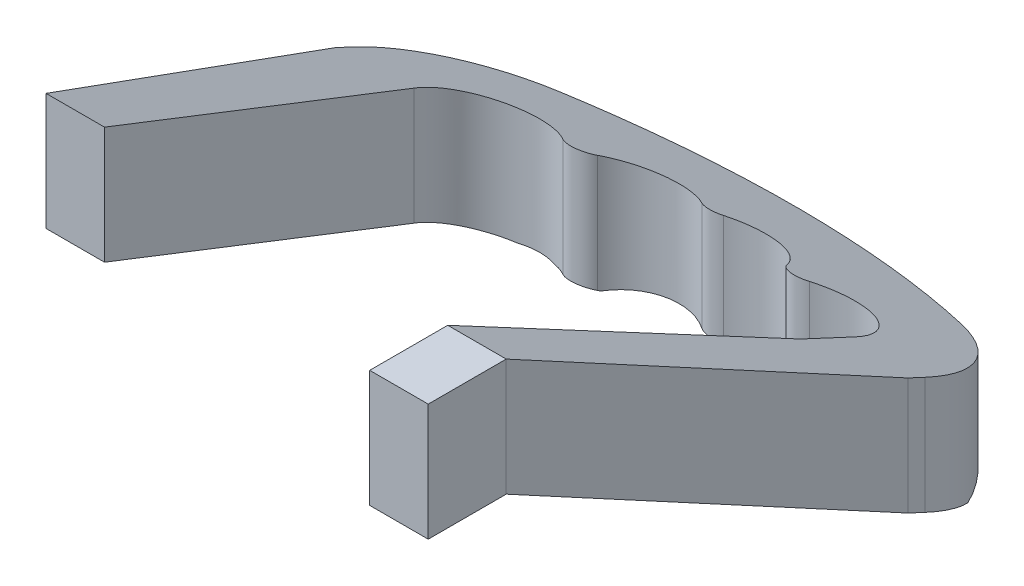
ISO-10303-21;
HEADER;
FILE_DESCRIPTION(('STEP AP214'),'2;1');
FILE_NAME('part.step','',(''),(''),'','','');
FILE_SCHEMA(('AUTOMOTIVE_DESIGN { 1 0 10303 214 1 1 1 1 }'));
ENDSEC;
DATA;
#1=APPLICATION_CONTEXT('core data for automotive mechanical design processes');
#2=APPLICATION_PROTOCOL_DEFINITION('international standard','automotive_design',2000,#1);
#3=PRODUCT_CONTEXT('',#1,'mechanical');
#4=PRODUCT('Part','Part','',(#3));
#5=PRODUCT_RELATED_PRODUCT_CATEGORY('part','',(#4));
#6=PRODUCT_DEFINITION_FORMATION('','',#4);
#7=PRODUCT_DEFINITION_CONTEXT('part definition',#1,'design');
#8=PRODUCT_DEFINITION('design','',#6,#7);
#9=PRODUCT_DEFINITION_SHAPE('','',#8);
#10=(LENGTH_UNIT() NAMED_UNIT(*) SI_UNIT(.MILLI.,.METRE.));
#11=(NAMED_UNIT(*) PLANE_ANGLE_UNIT() SI_UNIT($,.RADIAN.));
#12=(NAMED_UNIT(*) SI_UNIT($,.STERADIAN.) SOLID_ANGLE_UNIT());
#13=UNCERTAINTY_MEASURE_WITH_UNIT(LENGTH_MEASURE(1.E-05),#10,'distance_accuracy_value','');
#14=(GEOMETRIC_REPRESENTATION_CONTEXT(3) GLOBAL_UNCERTAINTY_ASSIGNED_CONTEXT((#13)) GLOBAL_UNIT_ASSIGNED_CONTEXT((#10,
#11,#12)) REPRESENTATION_CONTEXT('',''));
#15=CARTESIAN_POINT('',(0.,0.,0.));
#16=DIRECTION('',(0.,0.,1.));
#17=DIRECTION('',(1.,0.,0.));
#18=AXIS2_PLACEMENT_3D('',#15,#16,#17);
#19=CARTESIAN_POINT('',(37.465,14.4738745452836,-12.7));
#20=DIRECTION('',(0.,1.,0.));
#21=DIRECTION('',(0.,0.,1.));
#22=AXIS2_PLACEMENT_3D('',#19,#20,#21);
#23=PLANE('',#22);
#24=DIRECTION('',(0.,0.,1.));
#25=VECTOR('',#24,1.);
#26=CARTESIAN_POINT('',(37.465,14.4738745452836,-12.7));
#27=LINE('',#26,#25);
#28=CARTESIAN_POINT('',(37.465,14.4738745452836,-12.7));
#29=VERTEX_POINT('',#28);
#30=CARTESIAN_POINT('',(37.465,14.4738745452836,0.));
#31=VERTEX_POINT('',#30);
#32=EDGE_CURVE('E325',#29,#31,#27,.T.);
#33=ORIENTED_EDGE('',*,*,#32,.F.);
#34=DIRECTION('',(1.,0.,0.));
#35=VECTOR('',#34,1.);
#36=CARTESIAN_POINT('',(-46.5828276625066,14.4738745452836,-12.7));
#37=LINE('',#36,#35);
#38=CARTESIAN_POINT('',(27.94,14.4738745452836,-12.7));
#39=VERTEX_POINT('',#38);
#40=EDGE_CURVE('E449',#39,#29,#37,.T.);
#41=ORIENTED_EDGE('',*,*,#40,.F.);
#42=DIRECTION('',(0.,0.,1.));
#43=VECTOR('',#42,1.);
#44=CARTESIAN_POINT('',(27.94,14.4738745452836,-12.7));
#45=LINE('',#44,#43);
#46=CARTESIAN_POINT('',(27.94,14.4738745452836,0.));
#47=VERTEX_POINT('',#46);
#48=EDGE_CURVE('E339',#39,#47,#45,.T.);
#49=ORIENTED_EDGE('',*,*,#48,.T.);
#50=DIRECTION('',(-1.,0.,0.));
#51=VECTOR('',#50,1.);
#52=CARTESIAN_POINT('',(37.465,14.4738745452836,0.));
#53=LINE('',#52,#51);
#54=EDGE_CURVE('E264',#31,#47,#53,.T.);
#55=ORIENTED_EDGE('',*,*,#54,.F.);
#56=EDGE_LOOP('',(#33,#41,#49,#55));
#57=FACE_BOUND('',#56,.T.);
#58=ADVANCED_FACE('F71',(#57),#23,.T.);
#59=CARTESIAN_POINT('',(25.6698397491977,-36.3261254547164,-71.7460753438856));
#60=DIRECTION('',(0.,1.,0.));
#61=DIRECTION('',(0.,0.,1.));
#62=AXIS2_PLACEMENT_3D('',#59,#60,#61);
#63=CYLINDRICAL_SURFACE('',#62,20.9129879133088);
#64=DIRECTION('',(0.,1.,0.));
#65=VECTOR('',#64,1.);
#66=CARTESIAN_POINT('',(32.7148928779582,-36.3261254547164,-91.4366896023373));
#67=LINE('',#66,#65);
#68=CARTESIAN_POINT('',(32.7148928779582,-36.3261254547164,-91.4366896023373));
#69=VERTEX_POINT('',#68);
#70=CARTESIAN_POINT('',(32.7148928779582,-22.2416467940594,-91.4366896023373));
#71=VERTEX_POINT('',#70);
#72=EDGE_CURVE('E313',#69,#71,#67,.T.);
#73=ORIENTED_EDGE('',*,*,#72,.T.);
#74=CARTESIAN_POINT('',(25.6698397491977,-13.0597625715673,-71.7460753438856));
#75=DIRECTION('',(0.,0.90630778703665,-0.4226182617407));
#76=DIRECTION('',(0.,0.4226182617407,0.90630778703665));
#77=AXIS2_PLACEMENT_3D('',#74,#75,#76);
#78=ELLIPSE('',#77,23.0749290830744,20.9129879133088);
#79=CARTESIAN_POINT('',(46.5828276625066,-13.0597625715673,-71.7460753438856));
#80=VERTEX_POINT('',#79);
#81=EDGE_CURVE('E86',#71,#80,#78,.F.);
#82=ORIENTED_EDGE('',*,*,#81,.T.);
#83=DIRECTION('',(0.,1.,0.));
#84=VECTOR('',#83,1.);
#85=CARTESIAN_POINT('',(46.5828276625066,-36.3261254547164,-71.7460753438856));
#86=LINE('',#85,#84);
#87=CARTESIAN_POINT('',(46.5828276625066,-32.1097625715673,-71.7460753438856));
#88=VERTEX_POINT('',#87);
#89=EDGE_CURVE('E253',#88,#80,#86,.T.);
#90=ORIENTED_EDGE('',*,*,#89,.F.);
#91=CARTESIAN_POINT('',(25.6698397491977,-32.1097625715673,-71.7460753438856));
#92=DIRECTION('',(0.,0.90630778703665,-0.4226182617407));
#93=DIRECTION('',(0.,0.4226182617407,0.90630778703665));
#94=AXIS2_PLACEMENT_3D('',#91,#92,#93);
#95=ELLIPSE('',#94,23.0749290830744,20.9129879133088);
#96=CARTESIAN_POINT('',(44.5270651270852,-36.3261254547164,-80.7880947261784));
#97=VERTEX_POINT('',#96);
#98=EDGE_CURVE('E236',#97,#88,#95,.F.);
#99=ORIENTED_EDGE('',*,*,#98,.F.);
#100=CARTESIAN_POINT('',(25.6698397491977,-36.3261254547164,-71.7460753438856));
#101=DIRECTION('',(0.,1.,0.));
#102=DIRECTION('',(0.,0.,1.));
#103=AXIS2_PLACEMENT_3D('',#100,#101,#102);
#104=CIRCLE('',#103,20.9129879133088);
#105=EDGE_CURVE('E379',#97,#69,#104,.T.);
#106=ORIENTED_EDGE('',*,*,#105,.T.);
#107=EDGE_LOOP('',(#73,#82,#90,#99,#106));
#108=FACE_BOUND('',#107,.T.);
#109=ADVANCED_FACE('F260',(#108),#63,.T.);
#110=CARTESIAN_POINT('',(46.5828276625068,-36.3261254547164,-1.16760736321943E-13));
#111=DIRECTION('',(1.,0.,0.));
#112=DIRECTION('',(0.,0.,-1.));
#113=AXIS2_PLACEMENT_3D('',#110,#111,#112);
#114=PLANE('',#113);
#115=ORIENTED_EDGE('',*,*,#89,.T.);
#116=DIRECTION('',(0.,0.4226182617407,0.90630778703665));
#117=VECTOR('',#116,1.);
#118=CARTESIAN_POINT('',(46.5828276625066,-24.8885481664377,-97.1129879133088));
#119=LINE('',#118,#117);
#120=CARTESIAN_POINT('',(46.5828276625066,-11.7688649000295,-68.9777363536031));
#121=VERTEX_POINT('',#120);
#122=EDGE_CURVE('E257',#80,#121,#119,.T.);
#123=ORIENTED_EDGE('',*,*,#122,.T.);
#124=DIRECTION('',(0.,1.,0.));
#125=VECTOR('',#124,1.);
#126=CARTESIAN_POINT('',(46.5828276625066,-36.3261254547164,-68.9777363536031));
#127=LINE('',#126,#125);
#128=CARTESIAN_POINT('',(46.5828276625066,-30.8188649000295,-68.9777363536031));
#129=VERTEX_POINT('',#128);
#130=EDGE_CURVE('E255',#129,#121,#127,.T.);
#131=ORIENTED_EDGE('',*,*,#130,.F.);
#132=DIRECTION('',(0.,0.4226182617407,0.90630778703665));
#133=VECTOR('',#132,1.);
#134=CARTESIAN_POINT('',(46.5828276625066,-36.3261254547164,-80.7880947261784));
#135=LINE('',#134,#133);
#136=EDGE_CURVE('E239',#88,#129,#135,.T.);
#137=ORIENTED_EDGE('',*,*,#136,.F.);
#138=EDGE_LOOP('',(#115,#123,#131,#137));
#139=FACE_BOUND('',#138,.T.);
#140=ADVANCED_FACE('F251',(#139),#114,.T.);
#141=CARTESIAN_POINT('',(34.5017812224407,-36.3261254547164,5.58980008113953));
#142=DIRECTION('',(0.987128448086942,0.,0.159929443747751));
#143=DIRECTION('',(0.159929443747751,0.,-0.987128448086942));
#144=AXIS2_PLACEMENT_3D('',#141,#142,#143);
#145=PLANE('',#144);
#146=ORIENTED_EDGE('',*,*,#130,.T.);
#147=DIRECTION('',(-0.145277514777013,0.418134681710762,0.896692718633789));
#148=VECTOR('',#147,1.);
#149=CARTESIAN_POINT('',(38.1057351782418,12.6297240569836,-16.6547934846205));
#150=LINE('',#149,#148);
#151=EDGE_CURVE('E381',#121,#29,#150,.T.);
#152=ORIENTED_EDGE('',*,*,#151,.T.);
#153=DIRECTION('',(0.,1.,0.));
#154=VECTOR('',#153,1.);
#155=CARTESIAN_POINT('',(37.465,-4.57612545471637,-12.7));
#156=LINE('',#155,#154);
#157=CARTESIAN_POINT('',(37.465,-4.57612545471637,-12.7));
#158=VERTEX_POINT('',#157);
#159=EDGE_CURVE('E316',#158,#29,#156,.T.);
#160=ORIENTED_EDGE('',*,*,#159,.F.);
#161=DIRECTION('',(-0.145277514777013,0.418134681710762,0.896692718633789));
#162=VECTOR('',#161,1.);
#163=CARTESIAN_POINT('',(36.9485321192525,-3.0896384834761,-9.51221840292794));
#164=LINE('',#163,#162);
#165=EDGE_CURVE('E246',#129,#158,#164,.T.);
#166=ORIENTED_EDGE('',*,*,#165,.F.);
#167=EDGE_LOOP('',(#146,#152,#160,#166));
#168=FACE_BOUND('',#167,.T.);
#169=ADVANCED_FACE('F457',(#168),#145,.T.);
#170=CARTESIAN_POINT('',(25.5708811904425,-36.3261254547164,3.69504632170689));
#171=DIRECTION('',(-0.989720279713876,0.,-0.143016670088098));
#172=DIRECTION('',(-0.143016670088098,0.,0.989720279713876));
#173=AXIS2_PLACEMENT_3D('',#170,#171,#172);
#174=PLANE('',#173);
#175=DIRECTION('',(0.,-1.,0.));
#176=VECTOR('',#175,1.);
#177=CARTESIAN_POINT('',(27.94,14.4738745452836,-12.7));
#178=LINE('',#177,#176);
#179=CARTESIAN_POINT('',(27.94,-4.57612545471637,-12.7));
#180=VERTEX_POINT('',#179);
#181=EDGE_CURVE('E319',#39,#180,#178,.T.);
#182=ORIENTED_EDGE('',*,*,#181,.F.);
#183=DIRECTION('',(0.129854529110926,-0.419039976612588,-0.898634129815856));
#184=VECTOR('',#183,1.);
#185=CARTESIAN_POINT('',(28.7511287611418,11.8563657111614,-18.3132658092701));
#186=LINE('',#185,#184);
#187=CARTESIAN_POINT('',(35.1948397491978,-8.93746042813854,-62.9057698688712));
#188=VERTEX_POINT('',#187);
#189=EDGE_CURVE('E384',#39,#188,#186,.T.);
#190=ORIENTED_EDGE('',*,*,#189,.T.);
#191=DIRECTION('',(0.,1.,0.));
#192=VECTOR('',#191,1.);
#193=CARTESIAN_POINT('',(35.1948397491978,-36.3261254547164,-62.9057698688712));
#194=LINE('',#193,#192);
#195=CARTESIAN_POINT('',(35.1948397491978,-27.9874604281385,-62.9057698688712));
#196=VERTEX_POINT('',#195);
#197=EDGE_CURVE('E266',#196,#188,#194,.T.);
#198=ORIENTED_EDGE('',*,*,#197,.F.);
#199=DIRECTION('',(0.129854529110926,-0.419039976612588,-0.898634129815856));
#200=VECTOR('',#199,1.);
#201=CARTESIAN_POINT('',(27.7145375112077,-3.8485590257486,-11.1397287579482));
#202=LINE('',#201,#200);
#203=EDGE_CURVE('E416',#180,#196,#202,.T.);
#204=ORIENTED_EDGE('',*,*,#203,.F.);
#205=EDGE_LOOP('',(#182,#190,#198,#204));
#206=FACE_BOUND('',#205,.T.);
#207=ADVANCED_FACE('F470',(#206),#174,.T.);
#208=CARTESIAN_POINT('',(35.1948397491978,-36.3261254547164,0.));
#209=DIRECTION('',(-1.,0.,0.));
#210=DIRECTION('',(0.,0.,1.));
#211=AXIS2_PLACEMENT_3D('',#208,#209,#210);
#212=PLANE('',#211);
#213=ORIENTED_EDGE('',*,*,#197,.T.);
#214=DIRECTION('',(0.,-0.4226182617407,-0.90630778703665));
#215=VECTOR('',#214,1.);
#216=CARTESIAN_POINT('',(35.1948397491978,10.2650620451272,-21.7258275337126));
#217=LINE('',#216,#215);
#218=CARTESIAN_POINT('',(35.1948397491977,-13.0597625715673,-71.7460753438856));
#219=VERTEX_POINT('',#218);
#220=EDGE_CURVE('E387',#188,#219,#217,.T.);
#221=ORIENTED_EDGE('',*,*,#220,.T.);
#222=DIRECTION('',(0.,1.,0.));
#223=VECTOR('',#222,1.);
#224=CARTESIAN_POINT('',(35.1948397491977,-36.3261254547164,-71.7460753438856));
#225=LINE('',#224,#223);
#226=CARTESIAN_POINT('',(35.1948397491977,-32.1097625715673,-71.7460753438856));
#227=VERTEX_POINT('',#226);
#228=EDGE_CURVE('E274',#227,#219,#225,.T.);
#229=ORIENTED_EDGE('',*,*,#228,.F.);
#230=DIRECTION('',(0.,-0.4226182617407,-0.90630778703665));
#231=VECTOR('',#230,1.);
#232=CARTESIAN_POINT('',(35.1948397491978,-5.38248993713707,-14.4292542130043));
#233=LINE('',#232,#231);
#234=EDGE_CURVE('E418',#196,#227,#233,.T.);
#235=ORIENTED_EDGE('',*,*,#234,.F.);
#236=EDGE_LOOP('',(#213,#221,#229,#235));
#237=FACE_BOUND('',#236,.T.);
#238=ADVANCED_FACE('F473',(#237),#212,.T.);
#239=CARTESIAN_POINT('',(25.6698397491977,-36.3261254547164,-71.7460753438856));
#240=DIRECTION('',(0.,1.,0.));
#241=DIRECTION('',(0.,0.,1.));
#242=AXIS2_PLACEMENT_3D('',#239,#240,#241);
#243=CYLINDRICAL_SURFACE('',#242,9.525);
#244=CARTESIAN_POINT('',(25.6698397491977,-13.0597625715673,-71.7460753438856));
#245=DIRECTION('',(0.,0.90630778703665,-0.4226182617407));
#246=DIRECTION('',(0.,0.4226182617407,0.90630778703665));
#247=AXIS2_PLACEMENT_3D('',#244,#245,#246);
#248=ELLIPSE('',#247,10.5096746781177,9.525);
#249=CARTESIAN_POINT('',(20.0598178212185,-16.6492194646361,-79.4436904919423));
#250=VERTEX_POINT('',#249);
#251=EDGE_CURVE('E390',#250,#219,#248,.F.);
#252=ORIENTED_EDGE('',*,*,#251,.F.);
#253=DIRECTION('',(0.,1.,0.));
#254=VECTOR('',#253,1.);
#255=CARTESIAN_POINT('',(20.0598178212185,-36.3261254547164,-79.4436904919423));
#256=LINE('',#255,#254);
#257=CARTESIAN_POINT('',(20.0598178212185,-35.6992194646361,-79.4436904919423));
#258=VERTEX_POINT('',#257);
#259=EDGE_CURVE('E277',#258,#250,#256,.T.);
#260=ORIENTED_EDGE('',*,*,#259,.F.);
#261=CARTESIAN_POINT('',(25.6698397491977,-32.1097625715673,-71.7460753438856));
#262=DIRECTION('',(0.,0.90630778703665,-0.4226182617407));
#263=DIRECTION('',(0.,0.4226182617407,0.90630778703665));
#264=AXIS2_PLACEMENT_3D('',#261,#262,#263);
#265=ELLIPSE('',#264,10.5096746781177,9.525);
#266=CARTESIAN_POINT('',(22.6752595632215,-36.3261254547164,-80.7880947261784));
#267=VERTEX_POINT('',#266);
#268=EDGE_CURVE('E421',#258,#267,#265,.F.);
#269=ORIENTED_EDGE('',*,*,#268,.T.);
#270=CARTESIAN_POINT('',(25.6698397491977,-36.3261254547164,-71.7460753438856));
#271=DIRECTION('',(0.,1.,0.));
#272=DIRECTION('',(0.,0.,1.));
#273=AXIS2_PLACEMENT_3D('',#270,#271,#272);
#274=CIRCLE('',#273,9.525);
#275=CARTESIAN_POINT('',(28.664419935174,-36.3261254547164,-80.7880947261784));
#276=VERTEX_POINT('',#275);
#277=EDGE_CURVE('E315',#276,#267,#274,.T.);
#278=ORIENTED_EDGE('',*,*,#277,.F.);
#279=EDGE_CURVE('E420',#276,#227,#265,.F.);
#280=ORIENTED_EDGE('',*,*,#279,.T.);
#281=ORIENTED_EDGE('',*,*,#228,.T.);
#282=EDGE_LOOP('',(#252,#260,#269,#278,#280,#281));
#283=FACE_BOUND('',#282,.T.);
#284=ADVANCED_FACE('F478',(#283),#243,.F.);
#285=CARTESIAN_POINT('',(18.1898105118921,-36.3261254547164,-82.0095622079612));
#286=DIRECTION('',(0.,1.,0.));
#287=DIRECTION('',(0.,0.,1.));
#288=AXIS2_PLACEMENT_3D('',#285,#286,#287);
#289=CYLINDRICAL_SURFACE('',#288,3.175);
#290=ORIENTED_EDGE('',*,*,#259,.T.);
#291=CARTESIAN_POINT('',(18.1898105118921,-17.845705095659,-82.0095622079612));
#292=DIRECTION('',(0.,0.90630778703665,-0.4226182617407));
#293=DIRECTION('',(0.,0.4226182617407,0.90630778703665));
#294=AXIS2_PLACEMENT_3D('',#291,#292,#293);
#295=ELLIPSE('',#294,3.50322489270592,3.175);
#296=CARTESIAN_POINT('',(15.4103126769711,-17.1301063817064,-80.4749558135821));
#297=VERTEX_POINT('',#296);
#298=EDGE_CURVE('E392',#250,#297,#295,.F.);
#299=ORIENTED_EDGE('',*,*,#298,.T.);
#300=DIRECTION('',(0.,1.,0.));
#301=VECTOR('',#300,1.);
#302=CARTESIAN_POINT('',(15.4103126769711,-36.3261254547164,-80.4749558135821));
#303=LINE('',#302,#301);
#304=CARTESIAN_POINT('',(15.4103126769711,-36.1801063817064,-80.4749558135821));
#305=VERTEX_POINT('',#304);
#306=EDGE_CURVE('E280',#305,#297,#303,.T.);
#307=ORIENTED_EDGE('',*,*,#306,.F.);
#308=CARTESIAN_POINT('',(18.1898105118921,-36.895705095659,-82.0095622079612));
#309=DIRECTION('',(0.,0.90630778703665,-0.4226182617407));
#310=DIRECTION('',(0.,0.4226182617407,0.90630778703665));
#311=AXIS2_PLACEMENT_3D('',#308,#309,#310);
#312=ELLIPSE('',#311,3.50322489270592,3.175);
#313=EDGE_CURVE('E423',#258,#305,#312,.F.);
#314=ORIENTED_EDGE('',*,*,#313,.F.);
#315=EDGE_LOOP('',(#290,#299,#307,#314));
#316=FACE_BOUND('',#315,.T.);
#317=ADVANCED_FACE('F483',(#316),#289,.T.);
#318=CARTESIAN_POINT('',(7.07181917220806,-36.3261254547164,-75.8711366304446));
#319=DIRECTION('',(0.,1.,0.));
#320=DIRECTION('',(0.,0.,1.));
#321=AXIS2_PLACEMENT_3D('',#318,#319,#320);
#322=CYLINDRICAL_SURFACE('',#321,9.52499999999999);
#323=CARTESIAN_POINT('',(7.07181917220806,-14.9833102398485,-75.8711366304446));
#324=DIRECTION('',(0.,0.90630778703665,-0.4226182617407));
#325=DIRECTION('',(0.,0.4226182617407,0.90630778703665));
#326=AXIS2_PLACEMENT_3D('',#323,#324,#325);
#327=ELLIPSE('',#326,10.5096746781177,9.52499999999999);
#328=CARTESIAN_POINT('',(1.76795479305202,-18.6725862468584,-83.7828145591472));
#329=VERTEX_POINT('',#328);
#330=EDGE_CURVE('E395',#329,#297,#327,.F.);
#331=ORIENTED_EDGE('',*,*,#330,.F.);
#332=DIRECTION('',(0.,1.,0.));
#333=VECTOR('',#332,1.);
#334=CARTESIAN_POINT('',(1.76795479305202,-36.3261254547164,-83.7828145591472));
#335=LINE('',#334,#333);
#336=CARTESIAN_POINT('',(1.76795479305202,-36.3261254547164,-83.7828145591472));
#337=VERTEX_POINT('',#336);
#338=EDGE_CURVE('E283',#337,#329,#335,.T.);
#339=ORIENTED_EDGE('',*,*,#338,.F.);
#340=CARTESIAN_POINT('',(7.07181917220806,-36.3261254547164,-75.8711366304446));
#341=DIRECTION('',(0.,1.,0.));
#342=DIRECTION('',(0.,0.,1.));
#343=AXIS2_PLACEMENT_3D('',#340,#341,#342);
#344=CIRCLE('',#343,9.52499999999999);
#345=CARTESIAN_POINT('',(15.2295852931996,-36.3261254547164,-80.7880947261784));
#346=VERTEX_POINT('',#345);
#347=EDGE_CURVE('E354',#346,#337,#344,.T.);
#348=ORIENTED_EDGE('',*,*,#347,.F.);
#349=CARTESIAN_POINT('',(7.07181917220806,-34.0333102398485,-75.8711366304446));
#350=DIRECTION('',(0.,0.90630778703665,-0.4226182617407));
#351=DIRECTION('',(0.,0.4226182617407,0.90630778703665));
#352=AXIS2_PLACEMENT_3D('',#349,#350,#351);
#353=ELLIPSE('',#352,10.5096746781177,9.52499999999999);
#354=EDGE_CURVE('E362',#346,#305,#353,.F.);
#355=ORIENTED_EDGE('',*,*,#354,.T.);
#356=ORIENTED_EDGE('',*,*,#306,.T.);
#357=EDGE_LOOP('',(#331,#339,#348,#355,#356));
#358=FACE_BOUND('',#357,.T.);
#359=ADVANCED_FACE('F361',(#358),#322,.F.);
#360=CARTESIAN_POINT('',(0.,-36.3261254547164,-86.4200405353814));
#361=DIRECTION('',(0.,1.,0.));
#362=DIRECTION('',(0.,0.,1.));
#363=AXIS2_PLACEMENT_3D('',#360,#361,#362);
#364=CYLINDRICAL_SURFACE('',#363,3.17500000000001);
#365=ORIENTED_EDGE('',*,*,#338,.T.);
#366=CARTESIAN_POINT('',(0.,-19.9023449158617,-86.4200405353814));
#367=DIRECTION('',(0.,0.90630778703665,-0.4226182617407));
#368=DIRECTION('',(0.,0.4226182617407,0.90630778703665));
#369=AXIS2_PLACEMENT_3D('',#366,#367,#368);
#370=ELLIPSE('',#369,3.50322489270593,3.17500000000001);
#371=CARTESIAN_POINT('',(-1.76795479305202,-18.6725862468584,-83.7828145591472));
#372=VERTEX_POINT('',#371);
#373=EDGE_CURVE('E397',#329,#372,#370,.F.);
#374=ORIENTED_EDGE('',*,*,#373,.T.);
#375=DIRECTION('',(0.,1.,0.));
#376=VECTOR('',#375,1.);
#377=CARTESIAN_POINT('',(-1.76795479305202,-36.3261254547164,-83.7828145591472));
#378=LINE('',#377,#376);
#379=CARTESIAN_POINT('',(-1.76795479305202,-36.3261254547164,-83.7828145591472));
#380=VERTEX_POINT('',#379);
#381=EDGE_CURVE('E286',#380,#372,#378,.T.);
#382=ORIENTED_EDGE('',*,*,#381,.F.);
#383=CARTESIAN_POINT('',(0.,-36.3261254547164,-86.4200405353814));
#384=DIRECTION('',(0.,1.,0.));
#385=DIRECTION('',(0.,0.,1.));
#386=AXIS2_PLACEMENT_3D('',#383,#384,#385);
#387=CIRCLE('',#386,3.17500000000001);
#388=EDGE_CURVE('E365',#380,#337,#387,.T.);
#389=ORIENTED_EDGE('',*,*,#388,.T.);
#390=EDGE_LOOP('',(#365,#374,#382,#389));
#391=FACE_BOUND('',#390,.T.);
#392=ADVANCED_FACE('F485',(#391),#364,.T.);
#393=CARTESIAN_POINT('',(-7.07181917220806,-36.3261254547164,-75.8711366304446));
#394=DIRECTION('',(0.,1.,0.));
#395=DIRECTION('',(0.,0.,1.));
#396=AXIS2_PLACEMENT_3D('',#393,#394,#395);
#397=CYLINDRICAL_SURFACE('',#396,9.52499999999999);
#398=ORIENTED_EDGE('',*,*,#381,.T.);
#399=CARTESIAN_POINT('',(-7.07181917220806,-14.9833102398485,-75.8711366304446));
#400=DIRECTION('',(0.,0.90630778703665,-0.4226182617407));
#401=DIRECTION('',(0.,0.4226182617407,0.90630778703665));
#402=AXIS2_PLACEMENT_3D('',#399,#400,#401);
#403=ELLIPSE('',#402,10.5096746781177,9.52499999999999);
#404=CARTESIAN_POINT('',(-15.4103126769711,-17.1301063817064,-80.4749558135821));
#405=VERTEX_POINT('',#404);
#406=EDGE_CURVE('E400',#372,#405,#403,.T.);
#407=ORIENTED_EDGE('',*,*,#406,.T.);
#408=DIRECTION('',(0.,1.,0.));
#409=VECTOR('',#408,1.);
#410=CARTESIAN_POINT('',(-15.4103126769711,-36.3261254547164,-80.4749558135821));
#411=LINE('',#410,#409);
#412=CARTESIAN_POINT('',(-15.4103126769711,-36.1801063817064,-80.4749558135821));
#413=VERTEX_POINT('',#412);
#414=EDGE_CURVE('E289',#413,#405,#411,.T.);
#415=ORIENTED_EDGE('',*,*,#414,.F.);
#416=CARTESIAN_POINT('',(-7.07181917220806,-34.0333102398485,-75.8711366304446));
#417=DIRECTION('',(0.,0.90630778703665,-0.4226182617407));
#418=DIRECTION('',(0.,0.4226182617407,0.90630778703665));
#419=AXIS2_PLACEMENT_3D('',#416,#417,#418);
#420=ELLIPSE('',#419,10.5096746781177,9.52499999999999);
#421=CARTESIAN_POINT('',(-15.2295852931996,-36.3261254547164,-80.7880947261784));
#422=VERTEX_POINT('',#421);
#423=EDGE_CURVE('E426',#422,#413,#420,.T.);
#424=ORIENTED_EDGE('',*,*,#423,.F.);
#425=CARTESIAN_POINT('',(-7.07181917220806,-36.3261254547164,-75.8711366304446));
#426=DIRECTION('',(0.,1.,0.));
#427=DIRECTION('',(0.,0.,1.));
#428=AXIS2_PLACEMENT_3D('',#425,#426,#427);
#429=CIRCLE('',#428,9.52499999999999);
#430=EDGE_CURVE('E367',#422,#380,#429,.F.);
#431=ORIENTED_EDGE('',*,*,#430,.T.);
#432=EDGE_LOOP('',(#398,#407,#415,#424,#431));
#433=FACE_BOUND('',#432,.T.);
#434=ADVANCED_FACE('F490',(#433),#397,.F.);
#435=CARTESIAN_POINT('',(-18.1898105118921,-36.3261254547164,-82.0095622079612));
#436=DIRECTION('',(0.,1.,0.));
#437=DIRECTION('',(0.,0.,1.));
#438=AXIS2_PLACEMENT_3D('',#435,#436,#437);
#439=CYLINDRICAL_SURFACE('',#438,3.175);
#440=CARTESIAN_POINT('',(-18.1898105118921,-17.845705095659,-82.0095622079612));
#441=DIRECTION('',(0.,0.90630778703665,-0.4226182617407));
#442=DIRECTION('',(0.,0.4226182617407,0.90630778703665));
#443=AXIS2_PLACEMENT_3D('',#440,#441,#442);
#444=ELLIPSE('',#443,3.50322489270592,3.175);
#445=CARTESIAN_POINT('',(-20.0598178212185,-16.6492194646361,-79.4436904919423));
#446=VERTEX_POINT('',#445);
#447=EDGE_CURVE('E403',#446,#405,#444,.T.);
#448=ORIENTED_EDGE('',*,*,#447,.F.);
#449=DIRECTION('',(0.,1.,0.));
#450=VECTOR('',#449,1.);
#451=CARTESIAN_POINT('',(-20.0598178212185,-36.3261254547164,-79.4436904919423));
#452=LINE('',#451,#450);
#453=CARTESIAN_POINT('',(-20.0598178212185,-35.6992194646361,-79.4436904919423));
#454=VERTEX_POINT('',#453);
#455=EDGE_CURVE('E292',#454,#446,#452,.T.);
#456=ORIENTED_EDGE('',*,*,#455,.F.);
#457=CARTESIAN_POINT('',(-18.1898105118921,-36.895705095659,-82.0095622079612));
#458=DIRECTION('',(0.,0.90630778703665,-0.4226182617407));
#459=DIRECTION('',(0.,0.4226182617407,0.90630778703665));
#460=AXIS2_PLACEMENT_3D('',#457,#458,#459);
#461=ELLIPSE('',#460,3.50322489270592,3.175);
#462=EDGE_CURVE('E428',#454,#413,#461,.T.);
#463=ORIENTED_EDGE('',*,*,#462,.T.);
#464=ORIENTED_EDGE('',*,*,#414,.T.);
#465=EDGE_LOOP('',(#448,#456,#463,#464));
#466=FACE_BOUND('',#465,.T.);
#467=ADVANCED_FACE('F498',(#466),#439,.T.);
#468=CARTESIAN_POINT('',(-25.6698397491977,-36.3261254547164,-71.7460753438856));
#469=DIRECTION('',(0.,1.,0.));
#470=DIRECTION('',(0.,0.,1.));
#471=AXIS2_PLACEMENT_3D('',#468,#469,#470);
#472=CYLINDRICAL_SURFACE('',#471,9.525);
#473=ORIENTED_EDGE('',*,*,#455,.T.);
#474=CARTESIAN_POINT('',(-25.6698397491977,-13.0597625715673,-71.7460753438856));
#475=DIRECTION('',(0.,0.90630778703665,-0.4226182617407));
#476=DIRECTION('',(0.,0.4226182617407,0.90630778703665));
#477=AXIS2_PLACEMENT_3D('',#474,#475,#476);
#478=ELLIPSE('',#477,10.5096746781177,9.525);
#479=CARTESIAN_POINT('',(-35.0722382172259,-12.3494230818093,-70.2227473921883));
#480=VERTEX_POINT('',#479);
#481=EDGE_CURVE('E405',#446,#480,#478,.T.);
#482=ORIENTED_EDGE('',*,*,#481,.T.);
#483=DIRECTION('',(0.,1.,0.));
#484=VECTOR('',#483,1.);
#485=CARTESIAN_POINT('',(-35.0722382172259,-36.3261254547164,-70.2227473921883));
#486=LINE('',#485,#484);
#487=CARTESIAN_POINT('',(-35.0722382172259,-31.3994230818093,-70.2227473921883));
#488=VERTEX_POINT('',#487);
#489=EDGE_CURVE('E295',#488,#480,#486,.T.);
#490=ORIENTED_EDGE('',*,*,#489,.F.);
#491=CARTESIAN_POINT('',(-25.6698397491977,-32.1097625715673,-71.7460753438856));
#492=DIRECTION('',(0.,0.90630778703665,-0.4226182617407));
#493=DIRECTION('',(0.,0.4226182617407,0.90630778703665));
#494=AXIS2_PLACEMENT_3D('',#491,#492,#493);
#495=ELLIPSE('',#494,10.5096746781177,9.525);
#496=CARTESIAN_POINT('',(-28.664419935174,-36.3261254547164,-80.7880947261784));
#497=VERTEX_POINT('',#496);
#498=EDGE_CURVE('E432',#497,#488,#495,.T.);
#499=ORIENTED_EDGE('',*,*,#498,.F.);
#500=CARTESIAN_POINT('',(-25.6698397491977,-36.3261254547164,-71.7460753438856));
#501=DIRECTION('',(0.,1.,0.));
#502=DIRECTION('',(0.,0.,1.));
#503=AXIS2_PLACEMENT_3D('',#500,#501,#502);
#504=CIRCLE('',#503,9.525);
#505=CARTESIAN_POINT('',(-22.6752595632215,-36.3261254547164,-80.7880947261784));
#506=VERTEX_POINT('',#505);
#507=EDGE_CURVE('E371',#497,#506,#504,.F.);
#508=ORIENTED_EDGE('',*,*,#507,.T.);
#509=EDGE_CURVE('E431',#454,#506,#495,.T.);
#510=ORIENTED_EDGE('',*,*,#509,.F.);
#511=EDGE_LOOP('',(#473,#482,#490,#499,#508,#510));
#512=FACE_BOUND('',#511,.T.);
#513=ADVANCED_FACE('F500',(#512),#472,.F.);
#514=CARTESIAN_POINT('',(-25.9661384547685,-36.3261254547164,3.21953824246629));
#515=DIRECTION('',(-0.992400764216209,0.,0.123047645987581));
#516=DIRECTION('',(0.123047645987581,0.,0.992400764216209));
#517=AXIS2_PLACEMENT_3D('',#514,#515,#516);
#518=PLANE('',#517);
#519=DIRECTION('',(-0.111670132643244,-0.419974924100578,-0.900639131174165));
#520=VECTOR('',#519,1.);
#521=CARTESIAN_POINT('',(-28.6967377540938,11.6278952908763,-18.8032222067031));
#522=LINE('',#521,#520);
#523=CARTESIAN_POINT('',(-27.94,14.4738745452836,-12.7));
#524=VERTEX_POINT('',#523);
#525=EDGE_CURVE('E408',#524,#480,#522,.T.);
#526=ORIENTED_EDGE('',*,*,#525,.F.);
#527=DIRECTION('',(0.,1.,0.));
#528=VECTOR('',#527,1.);
#529=CARTESIAN_POINT('',(-27.94,-36.3261254547164,-12.7));
#530=LINE('',#529,#528);
#531=CARTESIAN_POINT('',(-27.94,-4.57612545471637,-12.7));
#532=VERTEX_POINT('',#531);
#533=EDGE_CURVE('E298',#532,#524,#530,.T.);
#534=ORIENTED_EDGE('',*,*,#533,.F.);
#535=DIRECTION('',(-0.111670132643244,-0.419974924100578,-0.900639131174165));
#536=VECTOR('',#535,1.);
#537=CARTESIAN_POINT('',(-27.8033183671779,-4.06208596168756,-11.5976387497845));
#538=LINE('',#537,#536);
#539=EDGE_CURVE('E434',#532,#488,#538,.T.);
#540=ORIENTED_EDGE('',*,*,#539,.T.);
#541=ORIENTED_EDGE('',*,*,#489,.T.);
#542=EDGE_LOOP('',(#526,#534,#540,#541));
#543=FACE_BOUND('',#542,.T.);
#544=ADVANCED_FACE('F507',(#543),#518,.F.);
#545=CARTESIAN_POINT('',(-34.5017812224407,-36.3261254547164,5.58980008113953));
#546=DIRECTION('',(0.987128448086942,0.,-0.159929443747751));
#547=DIRECTION('',(-0.159929443747751,0.,-0.987128448086942));
#548=AXIS2_PLACEMENT_3D('',#545,#546,#547);
#549=PLANE('',#548);
#550=DIRECTION('',(0.145277514777013,0.418134681710762,0.896692718633789));
#551=VECTOR('',#550,1.);
#552=CARTESIAN_POINT('',(-38.1057351782418,12.6297240569836,-16.6547934846205));
#553=LINE('',#552,#551);
#554=CARTESIAN_POINT('',(-46.5828276625066,-11.7688649000295,-68.9777363536031));
#555=VERTEX_POINT('',#554);
#556=CARTESIAN_POINT('',(-37.465,14.4738745452836,-12.7));
#557=VERTEX_POINT('',#556);
#558=EDGE_CURVE('E410',#555,#557,#553,.T.);
#559=ORIENTED_EDGE('',*,*,#558,.F.);
#560=DIRECTION('',(0.,1.,0.));
#561=VECTOR('',#560,1.);
#562=CARTESIAN_POINT('',(-46.5828276625066,-36.3261254547164,-68.9777363536031));
#563=LINE('',#562,#561);
#564=CARTESIAN_POINT('',(-46.5828276625066,-30.8188649000295,-68.9777363536031));
#565=VERTEX_POINT('',#564);
#566=EDGE_CURVE('E304',#565,#555,#563,.T.);
#567=ORIENTED_EDGE('',*,*,#566,.F.);
#568=DIRECTION('',(0.145277514777013,0.418134681710762,0.896692718633789));
#569=VECTOR('',#568,1.);
#570=CARTESIAN_POINT('',(-36.9485321192525,-3.0896384834761,-9.51221840292794));
#571=LINE('',#570,#569);
#572=CARTESIAN_POINT('',(-37.465,-4.57612545471637,-12.7));
#573=VERTEX_POINT('',#572);
#574=EDGE_CURVE('E437',#565,#573,#571,.T.);
#575=ORIENTED_EDGE('',*,*,#574,.T.);
#576=DIRECTION('',(0.,1.,0.));
#577=VECTOR('',#576,1.);
#578=CARTESIAN_POINT('',(-37.465,-36.3261254547164,-12.7));
#579=LINE('',#578,#577);
#580=EDGE_CURVE('E301',#573,#557,#579,.T.);
#581=ORIENTED_EDGE('',*,*,#580,.T.);
#582=EDGE_LOOP('',(#559,#567,#575,#581));
#583=FACE_BOUND('',#582,.T.);
#584=ADVANCED_FACE('F515',(#583),#549,.F.);
#585=CARTESIAN_POINT('',(-46.5828276625068,-36.3261254547164,-1.16760736321943E-13));
#586=DIRECTION('',(1.,0.,0.));
#587=DIRECTION('',(0.,0.,-1.));
#588=AXIS2_PLACEMENT_3D('',#585,#586,#587);
#589=PLANE('',#588);
#590=DIRECTION('',(0.,0.4226182617407,0.90630778703665));
#591=VECTOR('',#590,1.);
#592=CARTESIAN_POINT('',(-46.5828276625066,-24.8885481664377,-97.1129879133088));
#593=LINE('',#592,#591);
#594=CARTESIAN_POINT('',(-46.5828276625066,-13.0597625715673,-71.7460753438856));
#595=VERTEX_POINT('',#594);
#596=EDGE_CURVE('E447',#595,#555,#593,.T.);
#597=ORIENTED_EDGE('',*,*,#596,.F.);
#598=DIRECTION('',(0.,1.,0.));
#599=VECTOR('',#598,1.);
#600=CARTESIAN_POINT('',(-46.5828276625066,-36.3261254547164,-71.7460753438856));
#601=LINE('',#600,#599);
#602=CARTESIAN_POINT('',(-46.5828276625066,-32.1097625715673,-71.7460753438856));
#603=VERTEX_POINT('',#602);
#604=EDGE_CURVE('E307',#603,#595,#601,.T.);
#605=ORIENTED_EDGE('',*,*,#604,.F.);
#606=DIRECTION('',(0.,0.4226182617407,0.90630778703665));
#607=VECTOR('',#606,1.);
#608=CARTESIAN_POINT('',(-46.5828276625066,-36.3261254547164,-80.7880947261784));
#609=LINE('',#608,#607);
#610=EDGE_CURVE('E256',#603,#565,#609,.T.);
#611=ORIENTED_EDGE('',*,*,#610,.T.);
#612=ORIENTED_EDGE('',*,*,#566,.T.);
#613=EDGE_LOOP('',(#597,#605,#611,#612));
#614=FACE_BOUND('',#613,.T.);
#615=ADVANCED_FACE('F518',(#614),#589,.F.);
#616=CARTESIAN_POINT('',(-25.6698397491977,-36.3261254547164,-71.7460753438856));
#617=DIRECTION('',(0.,1.,0.));
#618=DIRECTION('',(0.,0.,1.));
#619=AXIS2_PLACEMENT_3D('',#616,#617,#618);
#620=CYLINDRICAL_SURFACE('',#619,20.9129879133088);
#621=ORIENTED_EDGE('',*,*,#604,.T.);
#622=CARTESIAN_POINT('',(-25.6698397491977,-13.0597625715673,-71.7460753438856));
#623=DIRECTION('',(0.,0.90630778703665,-0.4226182617407));
#624=DIRECTION('',(0.,0.4226182617407,0.90630778703665));
#625=AXIS2_PLACEMENT_3D('',#622,#623,#624);
#626=ELLIPSE('',#625,23.0749290830744,20.9129879133088);
#627=CARTESIAN_POINT('',(-32.7148928779582,-22.2416467940594,-91.4366896023373));
#628=VERTEX_POINT('',#627);
#629=EDGE_CURVE('E245',#595,#628,#626,.F.);
#630=ORIENTED_EDGE('',*,*,#629,.T.);
#631=DIRECTION('',(0.,1.,0.));
#632=VECTOR('',#631,1.);
#633=CARTESIAN_POINT('',(-32.7148928779582,-36.3261254547164,-91.4366896023373));
#634=LINE('',#633,#632);
#635=CARTESIAN_POINT('',(-32.7148928779582,-36.3261254547164,-91.4366896023373));
#636=VERTEX_POINT('',#635);
#637=EDGE_CURVE('E310',#636,#628,#634,.T.);
#638=ORIENTED_EDGE('',*,*,#637,.F.);
#639=CARTESIAN_POINT('',(-25.6698397491977,-36.3261254547164,-71.7460753438856));
#640=DIRECTION('',(0.,1.,0.));
#641=DIRECTION('',(0.,0.,1.));
#642=AXIS2_PLACEMENT_3D('',#639,#640,#641);
#643=CIRCLE('',#642,20.9129879133088);
#644=CARTESIAN_POINT('',(-44.5270651270852,-36.3261254547164,-80.7880947261784));
#645=VERTEX_POINT('',#644);
#646=EDGE_CURVE('E374',#636,#645,#643,.T.);
#647=ORIENTED_EDGE('',*,*,#646,.T.);
#648=CARTESIAN_POINT('',(-25.6698397491977,-32.1097625715673,-71.7460753438856));
#649=DIRECTION('',(0.,0.90630778703665,-0.4226182617407));
#650=DIRECTION('',(0.,0.4226182617407,0.90630778703665));
#651=AXIS2_PLACEMENT_3D('',#648,#649,#650);
#652=ELLIPSE('',#651,23.0749290830744,20.9129879133088);
#653=EDGE_CURVE('E93',#603,#645,#652,.F.);
#654=ORIENTED_EDGE('',*,*,#653,.F.);
#655=EDGE_LOOP('',(#621,#630,#638,#647,#654));
#656=FACE_BOUND('',#655,.T.);
#657=ADVANCED_FACE('F521',(#656),#620,.T.);
#658=CARTESIAN_POINT('',(0.,-36.3261254547164,0.));
#659=DIRECTION('',(0.,1.,0.));
#660=DIRECTION('',(0.,0.,1.));
#661=AXIS2_PLACEMENT_3D('',#658,#659,#660);
#662=CYLINDRICAL_SURFACE('',#661,97.1129879133088);
#663=ORIENTED_EDGE('',*,*,#637,.T.);
#664=CARTESIAN_POINT('',(0.,20.3959818038521,0.));
#665=DIRECTION('',(0.,0.90630778703665,-0.4226182617407));
#666=DIRECTION('',(0.,0.4226182617407,0.90630778703665));
#667=AXIS2_PLACEMENT_3D('',#664,#665,#666);
#668=ELLIPSE('',#667,107.152326508016,97.1129879133088);
#669=EDGE_CURVE('E12',#628,#71,#668,.F.);
#670=ORIENTED_EDGE('',*,*,#669,.T.);
#671=ORIENTED_EDGE('',*,*,#72,.F.);
#672=CARTESIAN_POINT('',(0.,-36.3261254547164,0.));
#673=DIRECTION('',(0.,1.,0.));
#674=DIRECTION('',(0.,0.,1.));
#675=AXIS2_PLACEMENT_3D('',#672,#673,#674);
#676=CIRCLE('',#675,97.1129879133088);
#677=EDGE_CURVE('E376',#69,#636,#676,.T.);
#678=ORIENTED_EDGE('',*,*,#677,.T.);
#679=EDGE_LOOP('',(#663,#670,#671,#678));
#680=FACE_BOUND('',#679,.T.);
#681=ADVANCED_FACE('F525',(#680),#662,.T.);
#682=CARTESIAN_POINT('',(37.465,-4.57612545471637,-12.7));
#683=DIRECTION('',(1.,0.,0.));
#684=DIRECTION('',(0.,0.,-1.));
#685=AXIS2_PLACEMENT_3D('',#682,#683,#684);
#686=PLANE('',#685);
#687=DIRECTION('',(0.,1.,0.));
#688=VECTOR('',#687,1.);
#689=CARTESIAN_POINT('',(37.465,-4.57612545471637,0.));
#690=LINE('',#689,#688);
#691=CARTESIAN_POINT('',(37.465,-4.57612545471637,0.));
#692=VERTEX_POINT('',#691);
#693=EDGE_CURVE('E261',#692,#31,#690,.T.);
#694=ORIENTED_EDGE('',*,*,#693,.F.);
#695=DIRECTION('',(0.,0.,1.));
#696=VECTOR('',#695,1.);
#697=CARTESIAN_POINT('',(37.465,-4.57612545471637,-12.7));
#698=LINE('',#697,#696);
#699=EDGE_CURVE('E334',#158,#692,#698,.T.);
#700=ORIENTED_EDGE('',*,*,#699,.F.);
#701=ORIENTED_EDGE('',*,*,#159,.T.);
#702=ORIENTED_EDGE('',*,*,#32,.T.);
#703=EDGE_LOOP('',(#694,#700,#701,#702));
#704=FACE_BOUND('',#703,.T.);
#705=ADVANCED_FACE('F73',(#704),#686,.T.);
#706=CARTESIAN_POINT('',(27.94,-4.57612545471637,-12.7));
#707=DIRECTION('',(0.,-1.,0.));
#708=DIRECTION('',(1.,0.,0.));
#709=AXIS2_PLACEMENT_3D('',#706,#707,#708);
#710=PLANE('',#709);
#711=DIRECTION('',(1.,0.,0.));
#712=VECTOR('',#711,1.);
#713=CARTESIAN_POINT('',(27.94,-4.57612545471637,0.));
#714=LINE('',#713,#712);
#715=CARTESIAN_POINT('',(27.94,-4.57612545471637,0.));
#716=VERTEX_POINT('',#715);
#717=EDGE_CURVE('E320',#716,#692,#714,.T.);
#718=ORIENTED_EDGE('',*,*,#717,.F.);
#719=DIRECTION('',(0.,0.,1.));
#720=VECTOR('',#719,1.);
#721=CARTESIAN_POINT('',(27.94,-4.57612545471637,-12.7));
#722=LINE('',#721,#720);
#723=EDGE_CURVE('E337',#180,#716,#722,.T.);
#724=ORIENTED_EDGE('',*,*,#723,.F.);
#725=DIRECTION('',(1.,0.,0.));
#726=VECTOR('',#725,1.);
#727=CARTESIAN_POINT('',(27.94,-4.57612545471637,-12.7));
#728=LINE('',#727,#726);
#729=EDGE_CURVE('E323',#180,#158,#728,.T.);
#730=ORIENTED_EDGE('',*,*,#729,.T.);
#731=ORIENTED_EDGE('',*,*,#699,.T.);
#732=EDGE_LOOP('',(#718,#724,#730,#731));
#733=FACE_BOUND('',#732,.T.);
#734=ADVANCED_FACE('F465',(#733),#710,.T.);
#735=CARTESIAN_POINT('',(27.94,14.4738745452836,-12.7));
#736=DIRECTION('',(-1.,0.,0.));
#737=DIRECTION('',(0.,0.,1.));
#738=AXIS2_PLACEMENT_3D('',#735,#736,#737);
#739=PLANE('',#738);
#740=DIRECTION('',(0.,-1.,0.));
#741=VECTOR('',#740,1.);
#742=CARTESIAN_POINT('',(27.94,14.4738745452836,0.));
#743=LINE('',#742,#741);
#744=EDGE_CURVE('E329',#47,#716,#743,.T.);
#745=ORIENTED_EDGE('',*,*,#744,.F.);
#746=ORIENTED_EDGE('',*,*,#48,.F.);
#747=ORIENTED_EDGE('',*,*,#181,.T.);
#748=ORIENTED_EDGE('',*,*,#723,.T.);
#749=EDGE_LOOP('',(#745,#746,#747,#748));
#750=FACE_BOUND('',#749,.T.);
#751=ADVANCED_FACE('F539',(#750),#739,.T.);
#752=CARTESIAN_POINT('',(0.,0.,0.));
#753=DIRECTION('',(0.,0.,1.));
#754=DIRECTION('',(1.,0.,0.));
#755=AXIS2_PLACEMENT_3D('',#752,#753,#754);
#756=PLANE('',#755);
#757=ORIENTED_EDGE('',*,*,#693,.T.);
#758=ORIENTED_EDGE('',*,*,#54,.T.);
#759=ORIENTED_EDGE('',*,*,#744,.T.);
#760=ORIENTED_EDGE('',*,*,#717,.T.);
#761=EDGE_LOOP('',(#757,#758,#759,#760));
#762=FACE_BOUND('',#761,.T.);
#763=ADVANCED_FACE('F542',(#762),#756,.T.);
#764=CARTESIAN_POINT('',(0.,-36.3261254547164,-12.7));
#765=DIRECTION('',(0.,0.,1.));
#766=DIRECTION('',(1.,0.,0.));
#767=AXIS2_PLACEMENT_3D('',#764,#765,#766);
#768=PLANE('',#767);
#769=DIRECTION('',(1.,0.,0.));
#770=VECTOR('',#769,1.);
#771=CARTESIAN_POINT('',(-46.5828276625066,-4.57612545471637,-12.7));
#772=LINE('',#771,#770);
#773=EDGE_CURVE('E441',#573,#532,#772,.T.);
#774=ORIENTED_EDGE('',*,*,#773,.T.);
#775=ORIENTED_EDGE('',*,*,#533,.T.);
#776=DIRECTION('',(1.,0.,0.));
#777=VECTOR('',#776,1.);
#778=CARTESIAN_POINT('',(0.,14.4738745452836,-12.7));
#779=LINE('',#778,#777);
#780=EDGE_CURVE('E269',#557,#524,#779,.T.);
#781=ORIENTED_EDGE('',*,*,#780,.F.);
#782=ORIENTED_EDGE('',*,*,#580,.F.);
#783=EDGE_LOOP('',(#774,#775,#781,#782));
#784=FACE_BOUND('',#783,.T.);
#785=ADVANCED_FACE('F510',(#784),#768,.T.);
#786=CARTESIAN_POINT('',(0.,-36.3261254547164,0.));
#787=DIRECTION('',(0.,1.,0.));
#788=DIRECTION('',(0.,0.,1.));
#789=AXIS2_PLACEMENT_3D('',#786,#787,#788);
#790=PLANE('',#789);
#791=ORIENTED_EDGE('',*,*,#105,.F.);
#792=DIRECTION('',(-1.,0.,0.));
#793=VECTOR('',#792,1.);
#794=CARTESIAN_POINT('',(0.,-36.3261254547164,-80.7880947261784));
#795=LINE('',#794,#793);
#796=EDGE_CURVE('E79',#97,#276,#795,.T.);
#797=ORIENTED_EDGE('',*,*,#796,.T.);
#798=ORIENTED_EDGE('',*,*,#277,.T.);
#799=EDGE_CURVE('E347',#267,#346,#795,.T.);
#800=ORIENTED_EDGE('',*,*,#799,.T.);
#801=ORIENTED_EDGE('',*,*,#347,.T.);
#802=ORIENTED_EDGE('',*,*,#388,.F.);
#803=ORIENTED_EDGE('',*,*,#430,.F.);
#804=EDGE_CURVE('E341',#422,#506,#795,.T.);
#805=ORIENTED_EDGE('',*,*,#804,.T.);
#806=ORIENTED_EDGE('',*,*,#507,.F.);
#807=EDGE_CURVE('E336',#497,#645,#795,.T.);
#808=ORIENTED_EDGE('',*,*,#807,.T.);
#809=ORIENTED_EDGE('',*,*,#646,.F.);
#810=ORIENTED_EDGE('',*,*,#677,.F.);
#811=EDGE_LOOP('',(#791,#797,#798,#800,#801,#802,#803,#805,#806,#808,#809,#810));
#812=FACE_BOUND('',#811,.T.);
#813=ADVANCED_FACE('F352',(#812),#790,.F.);
#814=CARTESIAN_POINT('',(-46.5828276625066,-36.3261254547164,-80.7880947261784));
#815=DIRECTION('',(0.,0.90630778703665,-0.4226182617407));
#816=DIRECTION('',(0.,0.4226182617407,0.90630778703665));
#817=AXIS2_PLACEMENT_3D('',#814,#815,#816);
#818=PLANE('',#817);
#819=ORIENTED_EDGE('',*,*,#498,.T.);
#820=ORIENTED_EDGE('',*,*,#539,.F.);
#821=ORIENTED_EDGE('',*,*,#773,.F.);
#822=ORIENTED_EDGE('',*,*,#574,.F.);
#823=ORIENTED_EDGE('',*,*,#610,.F.);
#824=ORIENTED_EDGE('',*,*,#653,.T.);
#825=ORIENTED_EDGE('',*,*,#807,.F.);
#826=EDGE_LOOP('',(#819,#820,#821,#822,#823,#824,#825));
#827=FACE_BOUND('',#826,.T.);
#828=ADVANCED_FACE('F503',(#827),#818,.F.);
#829=ORIENTED_EDGE('',*,*,#423,.T.);
#830=ORIENTED_EDGE('',*,*,#462,.F.);
#831=ORIENTED_EDGE('',*,*,#509,.T.);
#832=ORIENTED_EDGE('',*,*,#804,.F.);
#833=EDGE_LOOP('',(#829,#830,#831,#832));
#834=FACE_BOUND('',#833,.T.);
#835=ADVANCED_FACE('F493',(#834),#818,.F.);
#836=ORIENTED_EDGE('',*,*,#313,.T.);
#837=ORIENTED_EDGE('',*,*,#354,.F.);
#838=ORIENTED_EDGE('',*,*,#799,.F.);
#839=ORIENTED_EDGE('',*,*,#268,.F.);
#840=EDGE_LOOP('',(#836,#837,#838,#839));
#841=FACE_BOUND('',#840,.T.);
#842=ADVANCED_FACE('F481',(#841),#818,.F.);
#843=ORIENTED_EDGE('',*,*,#98,.T.);
#844=ORIENTED_EDGE('',*,*,#136,.T.);
#845=ORIENTED_EDGE('',*,*,#165,.T.);
#846=ORIENTED_EDGE('',*,*,#729,.F.);
#847=ORIENTED_EDGE('',*,*,#203,.T.);
#848=ORIENTED_EDGE('',*,*,#234,.T.);
#849=ORIENTED_EDGE('',*,*,#279,.F.);
#850=ORIENTED_EDGE('',*,*,#796,.F.);
#851=EDGE_LOOP('',(#843,#844,#845,#846,#847,#848,#849,#850));
#852=FACE_BOUND('',#851,.T.);
#853=ADVANCED_FACE('F238',(#852),#818,.F.);
#854=CARTESIAN_POINT('',(-46.5828276625066,-24.8885481664377,-97.1129879133088));
#855=DIRECTION('',(0.,0.90630778703665,-0.4226182617407));
#856=DIRECTION('',(0.,0.4226182617407,0.90630778703665));
#857=AXIS2_PLACEMENT_3D('',#854,#855,#856);
#858=PLANE('',#857);
#859=ORIENTED_EDGE('',*,*,#122,.F.);
#860=ORIENTED_EDGE('',*,*,#81,.F.);
#861=ORIENTED_EDGE('',*,*,#669,.F.);
#862=ORIENTED_EDGE('',*,*,#629,.F.);
#863=ORIENTED_EDGE('',*,*,#596,.T.);
#864=ORIENTED_EDGE('',*,*,#558,.T.);
#865=ORIENTED_EDGE('',*,*,#780,.T.);
#866=ORIENTED_EDGE('',*,*,#525,.T.);
#867=ORIENTED_EDGE('',*,*,#481,.F.);
#868=ORIENTED_EDGE('',*,*,#447,.T.);
#869=ORIENTED_EDGE('',*,*,#406,.F.);
#870=ORIENTED_EDGE('',*,*,#373,.F.);
#871=ORIENTED_EDGE('',*,*,#330,.T.);
#872=ORIENTED_EDGE('',*,*,#298,.F.);
#873=ORIENTED_EDGE('',*,*,#251,.T.);
#874=ORIENTED_EDGE('',*,*,#220,.F.);
#875=ORIENTED_EDGE('',*,*,#189,.F.);
#876=ORIENTED_EDGE('',*,*,#40,.T.);
#877=ORIENTED_EDGE('',*,*,#151,.F.);
#878=EDGE_LOOP('',(#859,#860,#861,#862,#863,#864,#865,#866,#867,#868,#869,#870,#871,#872,#873,
#874,#875,#876,#877));
#879=FACE_BOUND('',#878,.T.);
#880=ADVANCED_FACE('F451',(#879),#858,.T.);
#881=CLOSED_SHELL('',(#58,#109,#140,#169,#207,#238,#284,#317,#359,#392,#434,#467,#513,#544,#584,
#615,#657,#681,#705,#734,#751,#763,#785,#813,#828,#835,#842,#853,#880));
#882=MANIFOLD_SOLID_BREP('B2',#881);
#883=ADVANCED_BREP_SHAPE_REPRESENTATION('',(#18,#882),#14);
#884=SHAPE_DEFINITION_REPRESENTATION(#9,#883);
ENDSEC;
END-ISO-10303-21;
